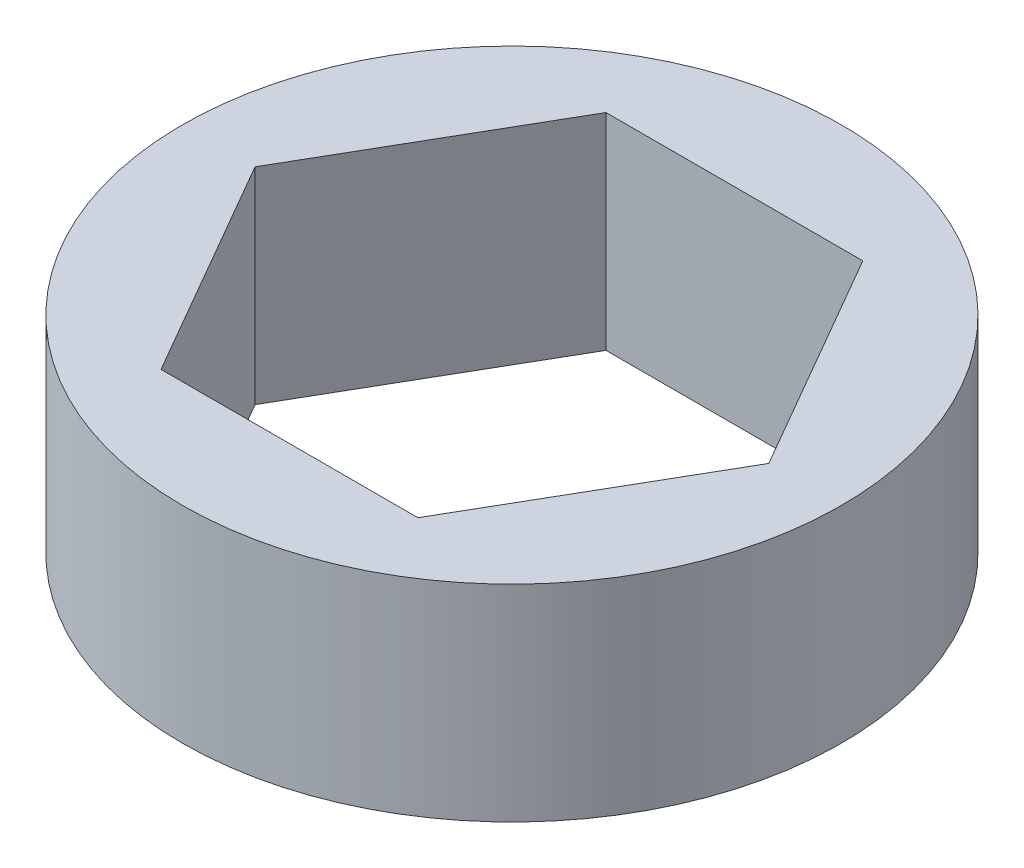
ISO-10303-21;
HEADER;
FILE_DESCRIPTION(('STEP AP214'),'2;1');
FILE_NAME('part.step','',(''),(''),'','','');
FILE_SCHEMA(('AUTOMOTIVE_DESIGN { 1 0 10303 214 1 1 1 1 }'));
ENDSEC;
DATA;
#1=APPLICATION_CONTEXT('core data for automotive mechanical design processes');
#2=APPLICATION_PROTOCOL_DEFINITION('international standard','automotive_design',2000,#1);
#3=PRODUCT_CONTEXT('',#1,'mechanical');
#4=PRODUCT('Part','Part','',(#3));
#5=PRODUCT_RELATED_PRODUCT_CATEGORY('part','',(#4));
#6=PRODUCT_DEFINITION_FORMATION('','',#4);
#7=PRODUCT_DEFINITION_CONTEXT('part definition',#1,'design');
#8=PRODUCT_DEFINITION('design','',#6,#7);
#9=PRODUCT_DEFINITION_SHAPE('','',#8);
#10=(LENGTH_UNIT() NAMED_UNIT(*) SI_UNIT(.MILLI.,.METRE.));
#11=(NAMED_UNIT(*) PLANE_ANGLE_UNIT() SI_UNIT($,.RADIAN.));
#12=(NAMED_UNIT(*) SI_UNIT($,.STERADIAN.) SOLID_ANGLE_UNIT());
#13=UNCERTAINTY_MEASURE_WITH_UNIT(LENGTH_MEASURE(1.E-05),#10,'distance_accuracy_value','');
#14=(GEOMETRIC_REPRESENTATION_CONTEXT(3) GLOBAL_UNCERTAINTY_ASSIGNED_CONTEXT((#13)) GLOBAL_UNIT_ASSIGNED_CONTEXT((#10,
#11,#12)) REPRESENTATION_CONTEXT('',''));
#15=CARTESIAN_POINT('',(0.,0.,0.));
#16=DIRECTION('',(0.,0.,1.));
#17=DIRECTION('',(1.,0.,0.));
#18=AXIS2_PLACEMENT_3D('',#15,#16,#17);
#19=CARTESIAN_POINT('',(0.,6.35,0.));
#20=DIRECTION('',(0.,1.,0.));
#21=DIRECTION('',(0.,0.,1.));
#22=AXIS2_PLACEMENT_3D('',#19,#20,#21);
#23=PLANE('',#22);
#24=CARTESIAN_POINT('',(0.,6.35,0.));
#25=DIRECTION('',(0.,1.,0.));
#26=DIRECTION('',(0.,0.,1.));
#27=AXIS2_PLACEMENT_3D('',#24,#25,#26);
#28=CIRCLE('',#27,10.16);
#29=CARTESIAN_POINT('',(0.,6.35,10.16));
#30=VERTEX_POINT('',#29);
#31=EDGE_CURVE('E11',#30,#30,#28,.T.);
#32=ORIENTED_EDGE('',*,*,#31,.T.);
#33=EDGE_LOOP('',(#32));
#34=FACE_BOUND('',#33,.T.);
#35=DIRECTION('',(-0.5,0.,-0.866025403784438));
#36=VECTOR('',#35,1.);
#37=CARTESIAN_POINT('',(7.9189362922049,6.35,0.));
#38=LINE('',#37,#36);
#39=CARTESIAN_POINT('',(7.9189362922049,6.35,0.));
#40=VERTEX_POINT('',#39);
#41=CARTESIAN_POINT('',(3.95946814610245,6.35,-6.858));
#42=VERTEX_POINT('',#41);
#43=EDGE_CURVE('E97',#40,#42,#38,.T.);
#44=ORIENTED_EDGE('',*,*,#43,.F.);
#45=DIRECTION('',(0.5,0.,-0.866025403784439));
#46=VECTOR('',#45,1.);
#47=CARTESIAN_POINT('',(3.95946814610245,6.35,6.858));
#48=LINE('',#47,#46);
#49=CARTESIAN_POINT('',(3.95946814610245,6.35,6.858));
#50=VERTEX_POINT('',#49);
#51=EDGE_CURVE('E89',#50,#40,#48,.T.);
#52=ORIENTED_EDGE('',*,*,#51,.F.);
#53=DIRECTION('',(1.,0.,0.));
#54=VECTOR('',#53,1.);
#55=CARTESIAN_POINT('',(-3.95946814610245,6.35,6.858));
#56=LINE('',#55,#54);
#57=CARTESIAN_POINT('',(-3.95946814610245,6.35,6.858));
#58=VERTEX_POINT('',#57);
#59=EDGE_CURVE('E117',#58,#50,#56,.T.);
#60=ORIENTED_EDGE('',*,*,#59,.F.);
#61=DIRECTION('',(0.5,0.,0.866025403784439));
#62=VECTOR('',#61,1.);
#63=CARTESIAN_POINT('',(-7.91893629220491,6.35,0.));
#64=LINE('',#63,#62);
#65=CARTESIAN_POINT('',(-7.91893629220491,6.35,0.));
#66=VERTEX_POINT('',#65);
#67=EDGE_CURVE('E115',#66,#58,#64,.T.);
#68=ORIENTED_EDGE('',*,*,#67,.F.);
#69=DIRECTION('',(-0.5,0.,0.866025403784439));
#70=VECTOR('',#69,1.);
#71=CARTESIAN_POINT('',(-3.95946814610245,6.35,-6.858));
#72=LINE('',#71,#70);
#73=CARTESIAN_POINT('',(-3.95946814610245,6.35,-6.858));
#74=VERTEX_POINT('',#73);
#75=EDGE_CURVE('E111',#74,#66,#72,.T.);
#76=ORIENTED_EDGE('',*,*,#75,.F.);
#77=DIRECTION('',(-1.,0.,0.));
#78=VECTOR('',#77,1.);
#79=CARTESIAN_POINT('',(3.95946814610245,6.35,-6.858));
#80=LINE('',#79,#78);
#81=EDGE_CURVE('E109',#42,#74,#80,.T.);
#82=ORIENTED_EDGE('',*,*,#81,.F.);
#83=EDGE_LOOP('',(#44,#52,#60,#68,#76,#82));
#84=FACE_BOUND('',#83,.T.);
#85=ADVANCED_FACE('F36',(#34,#84),#23,.T.);
#86=CARTESIAN_POINT('',(0.,0.,0.));
#87=DIRECTION('',(0.,1.,0.));
#88=DIRECTION('',(0.,0.,1.));
#89=AXIS2_PLACEMENT_3D('',#86,#87,#88);
#90=PLANE('',#89);
#91=CARTESIAN_POINT('',(0.,0.,0.));
#92=DIRECTION('',(0.,1.,0.));
#93=DIRECTION('',(0.,0.,1.));
#94=AXIS2_PLACEMENT_3D('',#91,#92,#93);
#95=CIRCLE('',#94,10.16);
#96=CARTESIAN_POINT('',(0.,0.,10.16));
#97=VERTEX_POINT('',#96);
#98=EDGE_CURVE('E40',#97,#97,#95,.T.);
#99=ORIENTED_EDGE('',*,*,#98,.F.);
#100=EDGE_LOOP('',(#99));
#101=FACE_BOUND('',#100,.T.);
#102=DIRECTION('',(0.5,0.,-0.866025403784439));
#103=VECTOR('',#102,1.);
#104=CARTESIAN_POINT('',(3.95946814610245,0.,6.858));
#105=LINE('',#104,#103);
#106=CARTESIAN_POINT('',(3.95946814610245,0.,6.858));
#107=VERTEX_POINT('',#106);
#108=CARTESIAN_POINT('',(7.9189362922049,0.,0.));
#109=VERTEX_POINT('',#108);
#110=EDGE_CURVE('E59',#107,#109,#105,.T.);
#111=ORIENTED_EDGE('',*,*,#110,.T.);
#112=DIRECTION('',(-0.5,0.,-0.866025403784438));
#113=VECTOR('',#112,1.);
#114=CARTESIAN_POINT('',(7.9189362922049,0.,0.));
#115=LINE('',#114,#113);
#116=CARTESIAN_POINT('',(3.95946814610245,0.,-6.858));
#117=VERTEX_POINT('',#116);
#118=EDGE_CURVE('E104',#109,#117,#115,.T.);
#119=ORIENTED_EDGE('',*,*,#118,.T.);
#120=DIRECTION('',(-1.,0.,0.));
#121=VECTOR('',#120,1.);
#122=CARTESIAN_POINT('',(3.95946814610245,0.,-6.858));
#123=LINE('',#122,#121);
#124=CARTESIAN_POINT('',(-3.95946814610245,0.,-6.858));
#125=VERTEX_POINT('',#124);
#126=EDGE_CURVE('E121',#117,#125,#123,.T.);
#127=ORIENTED_EDGE('',*,*,#126,.T.);
#128=DIRECTION('',(-0.5,0.,0.866025403784439));
#129=VECTOR('',#128,1.);
#130=CARTESIAN_POINT('',(-3.95946814610245,0.,-6.858));
#131=LINE('',#130,#129);
#132=CARTESIAN_POINT('',(-7.91893629220491,0.,0.));
#133=VERTEX_POINT('',#132);
#134=EDGE_CURVE('E124',#125,#133,#131,.T.);
#135=ORIENTED_EDGE('',*,*,#134,.T.);
#136=DIRECTION('',(0.5,0.,0.866025403784439));
#137=VECTOR('',#136,1.);
#138=CARTESIAN_POINT('',(-7.91893629220491,0.,0.));
#139=LINE('',#138,#137);
#140=CARTESIAN_POINT('',(-3.95946814610245,0.,6.858));
#141=VERTEX_POINT('',#140);
#142=EDGE_CURVE('E127',#133,#141,#139,.T.);
#143=ORIENTED_EDGE('',*,*,#142,.T.);
#144=DIRECTION('',(1.,0.,0.));
#145=VECTOR('',#144,1.);
#146=CARTESIAN_POINT('',(-3.95946814610245,0.,6.858));
#147=LINE('',#146,#145);
#148=EDGE_CURVE('E98',#141,#107,#147,.T.);
#149=ORIENTED_EDGE('',*,*,#148,.T.);
#150=EDGE_LOOP('',(#111,#119,#127,#135,#143,#149));
#151=FACE_BOUND('',#150,.T.);
#152=ADVANCED_FACE('F144',(#101,#151),#90,.F.);
#153=CARTESIAN_POINT('',(0.,6.35,0.));
#154=DIRECTION('',(0.,-1.,0.));
#155=DIRECTION('',(0.,0.,-1.));
#156=AXIS2_PLACEMENT_3D('',#153,#154,#155);
#157=CYLINDRICAL_SURFACE('',#156,10.16);
#158=ORIENTED_EDGE('',*,*,#31,.F.);
#159=EDGE_LOOP('',(#158));
#160=FACE_BOUND('',#159,.T.);
#161=ORIENTED_EDGE('',*,*,#98,.T.);
#162=EDGE_LOOP('',(#161));
#163=FACE_BOUND('',#162,.T.);
#164=ADVANCED_FACE('F38',(#160,#163),#157,.T.);
#165=CARTESIAN_POINT('',(3.95946814610245,6.35,6.858));
#166=DIRECTION('',(-0.866025403784439,0.,-0.5));
#167=DIRECTION('',(-0.5,0.,0.866025403784439));
#168=AXIS2_PLACEMENT_3D('',#165,#166,#167);
#169=PLANE('',#168);
#170=ORIENTED_EDGE('',*,*,#110,.F.);
#171=DIRECTION('',(0.,-1.,0.));
#172=VECTOR('',#171,1.);
#173=CARTESIAN_POINT('',(3.95946814610245,6.35,6.858));
#174=LINE('',#173,#172);
#175=EDGE_CURVE('E93',#50,#107,#174,.T.);
#176=ORIENTED_EDGE('',*,*,#175,.F.);
#177=ORIENTED_EDGE('',*,*,#51,.T.);
#178=DIRECTION('',(0.,-1.,0.));
#179=VECTOR('',#178,1.);
#180=CARTESIAN_POINT('',(7.9189362922049,6.35,0.));
#181=LINE('',#180,#179);
#182=EDGE_CURVE('E92',#40,#109,#181,.T.);
#183=ORIENTED_EDGE('',*,*,#182,.T.);
#184=EDGE_LOOP('',(#170,#176,#177,#183));
#185=FACE_BOUND('',#184,.T.);
#186=ADVANCED_FACE('F91',(#185),#169,.T.);
#187=CARTESIAN_POINT('',(7.9189362922049,6.35,0.));
#188=DIRECTION('',(-0.866025403784439,0.,0.5));
#189=DIRECTION('',(0.5,0.,0.866025403784439));
#190=AXIS2_PLACEMENT_3D('',#187,#188,#189);
#191=PLANE('',#190);
#192=ORIENTED_EDGE('',*,*,#118,.F.);
#193=ORIENTED_EDGE('',*,*,#182,.F.);
#194=ORIENTED_EDGE('',*,*,#43,.T.);
#195=DIRECTION('',(0.,-1.,0.));
#196=VECTOR('',#195,1.);
#197=CARTESIAN_POINT('',(3.95946814610245,6.35,-6.858));
#198=LINE('',#197,#196);
#199=EDGE_CURVE('E105',#42,#117,#198,.T.);
#200=ORIENTED_EDGE('',*,*,#199,.T.);
#201=EDGE_LOOP('',(#192,#193,#194,#200));
#202=FACE_BOUND('',#201,.T.);
#203=ADVANCED_FACE('F101',(#202),#191,.T.);
#204=CARTESIAN_POINT('',(3.95946814610245,6.35,-6.858));
#205=DIRECTION('',(0.,0.,1.));
#206=DIRECTION('',(1.,0.,0.));
#207=AXIS2_PLACEMENT_3D('',#204,#205,#206);
#208=PLANE('',#207);
#209=ORIENTED_EDGE('',*,*,#126,.F.);
#210=ORIENTED_EDGE('',*,*,#199,.F.);
#211=ORIENTED_EDGE('',*,*,#81,.T.);
#212=DIRECTION('',(0.,-1.,0.));
#213=VECTOR('',#212,1.);
#214=CARTESIAN_POINT('',(-3.95946814610245,6.35,-6.858));
#215=LINE('',#214,#213);
#216=EDGE_CURVE('E136',#74,#125,#215,.T.);
#217=ORIENTED_EDGE('',*,*,#216,.T.);
#218=EDGE_LOOP('',(#209,#210,#211,#217));
#219=FACE_BOUND('',#218,.T.);
#220=ADVANCED_FACE('F140',(#219),#208,.T.);
#221=CARTESIAN_POINT('',(-3.95946814610245,6.35,-6.858));
#222=DIRECTION('',(0.866025403784439,0.,0.5));
#223=DIRECTION('',(0.5,0.,-0.866025403784439));
#224=AXIS2_PLACEMENT_3D('',#221,#222,#223);
#225=PLANE('',#224);
#226=ORIENTED_EDGE('',*,*,#134,.F.);
#227=ORIENTED_EDGE('',*,*,#216,.F.);
#228=ORIENTED_EDGE('',*,*,#75,.T.);
#229=DIRECTION('',(0.,-1.,0.));
#230=VECTOR('',#229,1.);
#231=CARTESIAN_POINT('',(-7.91893629220491,6.35,0.));
#232=LINE('',#231,#230);
#233=EDGE_CURVE('E134',#66,#133,#232,.T.);
#234=ORIENTED_EDGE('',*,*,#233,.T.);
#235=EDGE_LOOP('',(#226,#227,#228,#234));
#236=FACE_BOUND('',#235,.T.);
#237=ADVANCED_FACE('F152',(#236),#225,.T.);
#238=CARTESIAN_POINT('',(-7.91893629220491,6.35,0.));
#239=DIRECTION('',(0.866025403784438,0.,-0.5));
#240=DIRECTION('',(-0.5,0.,-0.866025403784439));
#241=AXIS2_PLACEMENT_3D('',#238,#239,#240);
#242=PLANE('',#241);
#243=ORIENTED_EDGE('',*,*,#142,.F.);
#244=ORIENTED_EDGE('',*,*,#233,.F.);
#245=ORIENTED_EDGE('',*,*,#67,.T.);
#246=DIRECTION('',(0.,-1.,0.));
#247=VECTOR('',#246,1.);
#248=CARTESIAN_POINT('',(-3.95946814610245,6.35,6.858));
#249=LINE('',#248,#247);
#250=EDGE_CURVE('E51',#58,#141,#249,.T.);
#251=ORIENTED_EDGE('',*,*,#250,.T.);
#252=EDGE_LOOP('',(#243,#244,#245,#251));
#253=FACE_BOUND('',#252,.T.);
#254=ADVANCED_FACE('F150',(#253),#242,.T.);
#255=CARTESIAN_POINT('',(-3.95946814610245,6.35,6.858));
#256=DIRECTION('',(0.,0.,-1.));
#257=DIRECTION('',(-1.,0.,0.));
#258=AXIS2_PLACEMENT_3D('',#255,#256,#257);
#259=PLANE('',#258);
#260=ORIENTED_EDGE('',*,*,#148,.F.);
#261=ORIENTED_EDGE('',*,*,#250,.F.);
#262=ORIENTED_EDGE('',*,*,#59,.T.);
#263=ORIENTED_EDGE('',*,*,#175,.T.);
#264=EDGE_LOOP('',(#260,#261,#262,#263));
#265=FACE_BOUND('',#264,.T.);
#266=ADVANCED_FACE('F146',(#265),#259,.T.);
#267=CLOSED_SHELL('',(#85,#152,#164,#186,#203,#220,#237,#254,#266));
#268=MANIFOLD_SOLID_BREP('B2',#267);
#269=ADVANCED_BREP_SHAPE_REPRESENTATION('',(#18,#268),#14);
#270=SHAPE_DEFINITION_REPRESENTATION(#9,#269);
ENDSEC;
END-ISO-10303-21;
